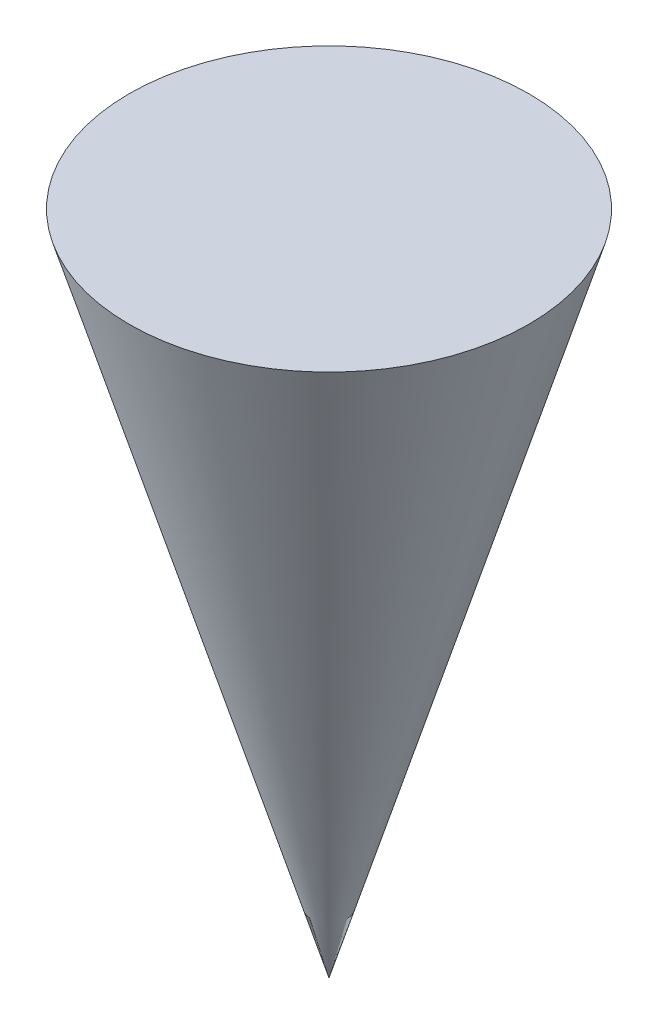
ISO-10303-21;
HEADER;
FILE_DESCRIPTION(('STEP AP214'),'2;1');
FILE_NAME('part.step','',(''),(''),'','','');
FILE_SCHEMA(('AUTOMOTIVE_DESIGN { 1 0 10303 214 1 1 1 1 }'));
ENDSEC;
DATA;
#1=APPLICATION_CONTEXT('core data for automotive mechanical design processes');
#2=APPLICATION_PROTOCOL_DEFINITION('international standard','automotive_design',2000,#1);
#3=PRODUCT_CONTEXT('',#1,'mechanical');
#4=PRODUCT('Part','Part','',(#3));
#5=PRODUCT_RELATED_PRODUCT_CATEGORY('part','',(#4));
#6=PRODUCT_DEFINITION_FORMATION('','',#4);
#7=PRODUCT_DEFINITION_CONTEXT('part definition',#1,'design');
#8=PRODUCT_DEFINITION('design','',#6,#7);
#9=PRODUCT_DEFINITION_SHAPE('','',#8);
#10=(LENGTH_UNIT() NAMED_UNIT(*) SI_UNIT(.MILLI.,.METRE.));
#11=(NAMED_UNIT(*) PLANE_ANGLE_UNIT() SI_UNIT($,.RADIAN.));
#12=(NAMED_UNIT(*) SI_UNIT($,.STERADIAN.) SOLID_ANGLE_UNIT());
#13=UNCERTAINTY_MEASURE_WITH_UNIT(LENGTH_MEASURE(1.E-05),#10,'distance_accuracy_value','');
#14=(GEOMETRIC_REPRESENTATION_CONTEXT(3) GLOBAL_UNCERTAINTY_ASSIGNED_CONTEXT((#13)) GLOBAL_UNIT_ASSIGNED_CONTEXT((#10,
#11,#12)) REPRESENTATION_CONTEXT('',''));
#15=CARTESIAN_POINT('',(0.,0.,0.));
#16=DIRECTION('',(0.,0.,1.));
#17=DIRECTION('',(1.,0.,0.));
#18=AXIS2_PLACEMENT_3D('',#15,#16,#17);
#19=CARTESIAN_POINT('',(0.,-100.,0.));
#20=DIRECTION('',(0.,1.,0.));
#21=DIRECTION('',(-1.,0.,0.));
#22=AXIS2_PLACEMENT_3D('',#19,#20,#21);
#23=CONICAL_SURFACE('',#22,0.,0.291456794477867);
#24=CARTESIAN_POINT('',(0.,0.,0.));
#25=DIRECTION('',(0.,-1.,0.));
#26=DIRECTION('',(1.,0.,0.));
#27=AXIS2_PLACEMENT_3D('',#24,#25,#26);
#28=CIRCLE('',#27,30.);
#29=CARTESIAN_POINT('',(30.,0.,0.));
#30=VERTEX_POINT('',#29);
#31=EDGE_CURVE('E11',#30,#30,#28,.T.);
#32=ORIENTED_EDGE('',*,*,#31,.T.);
#33=EDGE_LOOP('',(#32));
#34=FACE_BOUND('',#33,.T.);
#35=CARTESIAN_POINT('',(0.,-100.,0.));
#36=VERTEX_POINT('',#35);
#37=VERTEX_LOOP('',#36);
#38=FACE_BOUND('',#37,.T.);
#39=ADVANCED_FACE('F40',(#34,#38),#23,.T.);
#40=CARTESIAN_POINT('',(0.,0.,0.));
#41=DIRECTION('',(0.,1.,0.));
#42=DIRECTION('',(-1.,0.,0.));
#43=AXIS2_PLACEMENT_3D('',#40,#41,#42);
#44=PLANE('',#43);
#45=ORIENTED_EDGE('',*,*,#31,.F.);
#46=EDGE_LOOP('',(#45));
#47=FACE_BOUND('',#46,.T.);
#48=ADVANCED_FACE('F48',(#47),#44,.T.);
#49=CLOSED_SHELL('',(#39,#48));
#50=MANIFOLD_SOLID_BREP('B2',#49);
#51=ADVANCED_BREP_SHAPE_REPRESENTATION('',(#18,#50),#14);
#52=SHAPE_DEFINITION_REPRESENTATION(#9,#51);
ENDSEC;
END-ISO-10303-21;
